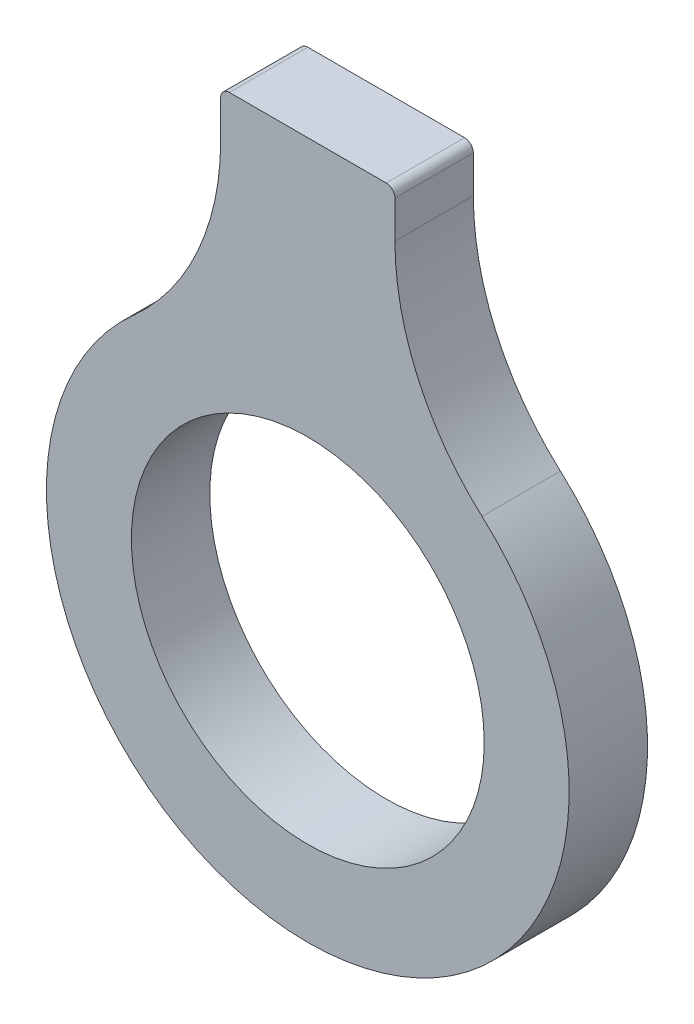
ISO-10303-21;
HEADER;
FILE_DESCRIPTION(('STEP AP214'),'2;1');
FILE_NAME('part.step','',(''),(''),'','','');
FILE_SCHEMA(('AUTOMOTIVE_DESIGN { 1 0 10303 214 1 1 1 1 }'));
ENDSEC;
DATA;
#1=APPLICATION_CONTEXT('core data for automotive mechanical design processes');
#2=APPLICATION_PROTOCOL_DEFINITION('international standard','automotive_design',2000,#1);
#3=PRODUCT_CONTEXT('',#1,'mechanical');
#4=PRODUCT('Part','Part','',(#3));
#5=PRODUCT_RELATED_PRODUCT_CATEGORY('part','',(#4));
#6=PRODUCT_DEFINITION_FORMATION('','',#4);
#7=PRODUCT_DEFINITION_CONTEXT('part definition',#1,'design');
#8=PRODUCT_DEFINITION('design','',#6,#7);
#9=PRODUCT_DEFINITION_SHAPE('','',#8);
#10=(LENGTH_UNIT() NAMED_UNIT(*) SI_UNIT(.MILLI.,.METRE.));
#11=(NAMED_UNIT(*) PLANE_ANGLE_UNIT() SI_UNIT($,.RADIAN.));
#12=(NAMED_UNIT(*) SI_UNIT($,.STERADIAN.) SOLID_ANGLE_UNIT());
#13=UNCERTAINTY_MEASURE_WITH_UNIT(LENGTH_MEASURE(1.E-05),#10,'distance_accuracy_value','');
#14=(GEOMETRIC_REPRESENTATION_CONTEXT(3) GLOBAL_UNCERTAINTY_ASSIGNED_CONTEXT((#13)) GLOBAL_UNIT_ASSIGNED_CONTEXT((#10,
#11,#12)) REPRESENTATION_CONTEXT('',''));
#15=CARTESIAN_POINT('',(0.,0.,0.));
#16=DIRECTION('',(0.,0.,1.));
#17=DIRECTION('',(1.,0.,0.));
#18=AXIS2_PLACEMENT_3D('',#15,#16,#17);
#19=CARTESIAN_POINT('',(-8.00000000000001,8.94427190999915,-1.8));
#20=DIRECTION('',(0.,0.,1.));
#21=DIRECTION('',(1.,0.,0.));
#22=AXIS2_PLACEMENT_3D('',#19,#20,#21);
#23=CYLINDRICAL_SURFACE('',#22,6.);
#24=CARTESIAN_POINT('',(-8.00000000000001,8.94427190999915,0.));
#25=DIRECTION('',(0.,0.,-1.));
#26=DIRECTION('',(1.,0.,0.));
#27=AXIS2_PLACEMENT_3D('',#24,#25,#26);
#28=CIRCLE('',#27,6.);
#29=CARTESIAN_POINT('',(-2.00000000000001,8.94427190999924,0.));
#30=VERTEX_POINT('',#29);
#31=CARTESIAN_POINT('',(-4.00000000000001,4.47213595499957,0.));
#32=VERTEX_POINT('',#31);
#33=EDGE_CURVE('E144',#30,#32,#28,.T.);
#34=ORIENTED_EDGE('',*,*,#33,.F.);
#35=DIRECTION('',(0.,0.,1.));
#36=VECTOR('',#35,1.);
#37=CARTESIAN_POINT('',(-2.00000000000001,8.94427190999924,-1.8));
#38=LINE('',#37,#36);
#39=CARTESIAN_POINT('',(-2.00000000000001,8.94427190999924,-1.8));
#40=VERTEX_POINT('',#39);
#41=EDGE_CURVE('E12',#40,#30,#38,.T.);
#42=ORIENTED_EDGE('',*,*,#41,.F.);
#43=CARTESIAN_POINT('',(-8.00000000000001,8.94427190999915,-1.8));
#44=DIRECTION('',(0.,0.,-1.));
#45=DIRECTION('',(1.,0.,0.));
#46=AXIS2_PLACEMENT_3D('',#43,#44,#45);
#47=CIRCLE('',#46,6.);
#48=CARTESIAN_POINT('',(-4.00000000000001,4.47213595499957,-1.8));
#49=VERTEX_POINT('',#48);
#50=EDGE_CURVE('E173',#40,#49,#47,.T.);
#51=ORIENTED_EDGE('',*,*,#50,.T.);
#52=DIRECTION('',(0.,0.,1.));
#53=VECTOR('',#52,1.);
#54=CARTESIAN_POINT('',(-4.00000000000001,4.47213595499957,-1.8));
#55=LINE('',#54,#53);
#56=EDGE_CURVE('E50',#49,#32,#55,.T.);
#57=ORIENTED_EDGE('',*,*,#56,.T.);
#58=EDGE_LOOP('',(#34,#42,#51,#57));
#59=FACE_BOUND('',#58,.T.);
#60=ADVANCED_FACE('F47',(#59),#23,.F.);
#61=CARTESIAN_POINT('',(-2.00000000000001,8.94427190999924,-1.8));
#62=DIRECTION('',(-1.,0.,0.));
#63=DIRECTION('',(0.,0.,1.));
#64=AXIS2_PLACEMENT_3D('',#61,#62,#63);
#65=PLANE('',#64);
#66=DIRECTION('',(0.,-1.,0.));
#67=VECTOR('',#66,1.);
#68=CARTESIAN_POINT('',(-2.00000000000001,8.94427190999924,0.));
#69=LINE('',#68,#67);
#70=CARTESIAN_POINT('',(-2.00000000000001,9.8,0.));
#71=VERTEX_POINT('',#70);
#72=EDGE_CURVE('E170',#71,#30,#69,.T.);
#73=ORIENTED_EDGE('',*,*,#72,.F.);
#74=DIRECTION('',(0.,0.,1.));
#75=VECTOR('',#74,1.);
#76=CARTESIAN_POINT('',(-2.00000000000001,9.8,-1.8));
#77=LINE('',#76,#75);
#78=CARTESIAN_POINT('',(-2.00000000000001,9.8,-1.8));
#79=VERTEX_POINT('',#78);
#80=EDGE_CURVE('E56',#79,#71,#77,.T.);
#81=ORIENTED_EDGE('',*,*,#80,.F.);
#82=DIRECTION('',(0.,-1.,0.));
#83=VECTOR('',#82,1.);
#84=CARTESIAN_POINT('',(-2.00000000000001,8.94427190999924,-1.8));
#85=LINE('',#84,#83);
#86=EDGE_CURVE('E134',#79,#40,#85,.T.);
#87=ORIENTED_EDGE('',*,*,#86,.T.);
#88=ORIENTED_EDGE('',*,*,#41,.T.);
#89=EDGE_LOOP('',(#73,#81,#87,#88));
#90=FACE_BOUND('',#89,.T.);
#91=ADVANCED_FACE('F185',(#90),#65,.T.);
#92=CARTESIAN_POINT('',(-1.80000000000001,9.8,-1.8));
#93=DIRECTION('',(0.,0.,1.));
#94=DIRECTION('',(1.,0.,0.));
#95=AXIS2_PLACEMENT_3D('',#92,#93,#94);
#96=CYLINDRICAL_SURFACE('',#95,0.199999999999999);
#97=CARTESIAN_POINT('',(-1.80000000000001,9.8,0.));
#98=DIRECTION('',(0.,0.,1.));
#99=DIRECTION('',(1.,0.,0.));
#100=AXIS2_PLACEMENT_3D('',#97,#98,#99);
#101=CIRCLE('',#100,0.199999999999999);
#102=CARTESIAN_POINT('',(-1.80000000000001,10.,0.));
#103=VERTEX_POINT('',#102);
#104=EDGE_CURVE('E121',#103,#71,#101,.T.);
#105=ORIENTED_EDGE('',*,*,#104,.F.);
#106=DIRECTION('',(0.,0.,1.));
#107=VECTOR('',#106,1.);
#108=CARTESIAN_POINT('',(-1.80000000000001,10.,-1.8));
#109=LINE('',#108,#107);
#110=CARTESIAN_POINT('',(-1.80000000000001,10.,-1.8));
#111=VERTEX_POINT('',#110);
#112=EDGE_CURVE('E116',#111,#103,#109,.T.);
#113=ORIENTED_EDGE('',*,*,#112,.F.);
#114=CARTESIAN_POINT('',(-1.80000000000001,9.8,-1.8));
#115=DIRECTION('',(0.,0.,1.));
#116=DIRECTION('',(1.,0.,0.));
#117=AXIS2_PLACEMENT_3D('',#114,#115,#116);
#118=CIRCLE('',#117,0.199999999999999);
#119=EDGE_CURVE('E119',#111,#79,#118,.T.);
#120=ORIENTED_EDGE('',*,*,#119,.T.);
#121=ORIENTED_EDGE('',*,*,#80,.T.);
#122=EDGE_LOOP('',(#105,#113,#120,#121));
#123=FACE_BOUND('',#122,.T.);
#124=ADVANCED_FACE('F118',(#123),#96,.T.);
#125=CARTESIAN_POINT('',(-1.80000000000001,10.,-1.8));
#126=DIRECTION('',(0.,1.,0.));
#127=DIRECTION('',(-1.,0.,0.));
#128=AXIS2_PLACEMENT_3D('',#125,#126,#127);
#129=PLANE('',#128);
#130=DIRECTION('',(-1.,0.,0.));
#131=VECTOR('',#130,1.);
#132=CARTESIAN_POINT('',(-1.80000000000001,10.,0.));
#133=LINE('',#132,#131);
#134=CARTESIAN_POINT('',(1.79999999999999,10.,0.));
#135=VERTEX_POINT('',#134);
#136=EDGE_CURVE('E165',#135,#103,#133,.T.);
#137=ORIENTED_EDGE('',*,*,#136,.F.);
#138=DIRECTION('',(0.,0.,1.));
#139=VECTOR('',#138,1.);
#140=CARTESIAN_POINT('',(1.79999999999999,10.,-1.8));
#141=LINE('',#140,#139);
#142=CARTESIAN_POINT('',(1.79999999999999,10.,-1.8));
#143=VERTEX_POINT('',#142);
#144=EDGE_CURVE('E126',#143,#135,#141,.T.);
#145=ORIENTED_EDGE('',*,*,#144,.F.);
#146=DIRECTION('',(-1.,0.,0.));
#147=VECTOR('',#146,1.);
#148=CARTESIAN_POINT('',(-1.80000000000001,10.,-1.8));
#149=LINE('',#148,#147);
#150=EDGE_CURVE('E132',#143,#111,#149,.T.);
#151=ORIENTED_EDGE('',*,*,#150,.T.);
#152=ORIENTED_EDGE('',*,*,#112,.T.);
#153=EDGE_LOOP('',(#137,#145,#151,#152));
#154=FACE_BOUND('',#153,.T.);
#155=ADVANCED_FACE('F136',(#154),#129,.T.);
#156=CARTESIAN_POINT('',(1.79999999999999,9.8,-1.8));
#157=DIRECTION('',(0.,0.,1.));
#158=DIRECTION('',(1.,0.,0.));
#159=AXIS2_PLACEMENT_3D('',#156,#157,#158);
#160=CYLINDRICAL_SURFACE('',#159,0.199999999999999);
#161=CARTESIAN_POINT('',(1.79999999999999,9.8,0.));
#162=DIRECTION('',(0.,0.,1.));
#163=DIRECTION('',(1.,0.,0.));
#164=AXIS2_PLACEMENT_3D('',#161,#162,#163);
#165=CIRCLE('',#164,0.199999999999999);
#166=CARTESIAN_POINT('',(1.99999999999999,9.80000000000001,0.));
#167=VERTEX_POINT('',#166);
#168=EDGE_CURVE('E161',#167,#135,#165,.T.);
#169=ORIENTED_EDGE('',*,*,#168,.F.);
#170=DIRECTION('',(0.,0.,1.));
#171=VECTOR('',#170,1.);
#172=CARTESIAN_POINT('',(1.99999999999999,9.80000000000001,-1.8));
#173=LINE('',#172,#171);
#174=CARTESIAN_POINT('',(1.99999999999999,9.80000000000001,-1.8));
#175=VERTEX_POINT('',#174);
#176=EDGE_CURVE('E177',#175,#167,#173,.T.);
#177=ORIENTED_EDGE('',*,*,#176,.F.);
#178=CARTESIAN_POINT('',(1.79999999999999,9.8,-1.8));
#179=DIRECTION('',(0.,0.,1.));
#180=DIRECTION('',(1.,0.,0.));
#181=AXIS2_PLACEMENT_3D('',#178,#179,#180);
#182=CIRCLE('',#181,0.199999999999999);
#183=EDGE_CURVE('E137',#175,#143,#182,.T.);
#184=ORIENTED_EDGE('',*,*,#183,.T.);
#185=ORIENTED_EDGE('',*,*,#144,.T.);
#186=EDGE_LOOP('',(#169,#177,#184,#185));
#187=FACE_BOUND('',#186,.T.);
#188=ADVANCED_FACE('F198',(#187),#160,.T.);
#189=CARTESIAN_POINT('',(1.99999999999999,8.94427190999917,-1.8));
#190=DIRECTION('',(1.,0.,0.));
#191=DIRECTION('',(0.,0.,-1.));
#192=AXIS2_PLACEMENT_3D('',#189,#190,#191);
#193=PLANE('',#192);
#194=DIRECTION('',(0.,1.,0.));
#195=VECTOR('',#194,1.);
#196=CARTESIAN_POINT('',(1.99999999999999,8.94427190999917,0.));
#197=LINE('',#196,#195);
#198=CARTESIAN_POINT('',(1.99999999999999,8.94427190999917,0.));
#199=VERTEX_POINT('',#198);
#200=EDGE_CURVE('E157',#199,#167,#197,.T.);
#201=ORIENTED_EDGE('',*,*,#200,.F.);
#202=DIRECTION('',(0.,0.,1.));
#203=VECTOR('',#202,1.);
#204=CARTESIAN_POINT('',(1.99999999999999,8.94427190999917,-1.8));
#205=LINE('',#204,#203);
#206=CARTESIAN_POINT('',(1.99999999999999,8.94427190999917,-1.8));
#207=VERTEX_POINT('',#206);
#208=EDGE_CURVE('E179',#207,#199,#205,.T.);
#209=ORIENTED_EDGE('',*,*,#208,.F.);
#210=DIRECTION('',(0.,1.,0.));
#211=VECTOR('',#210,1.);
#212=CARTESIAN_POINT('',(1.99999999999999,8.94427190999917,-1.8));
#213=LINE('',#212,#211);
#214=EDGE_CURVE('E139',#207,#175,#213,.T.);
#215=ORIENTED_EDGE('',*,*,#214,.T.);
#216=ORIENTED_EDGE('',*,*,#176,.T.);
#217=EDGE_LOOP('',(#201,#209,#215,#216));
#218=FACE_BOUND('',#217,.T.);
#219=ADVANCED_FACE('F201',(#218),#193,.T.);
#220=CARTESIAN_POINT('',(7.99999999999999,8.94427190999917,-1.8));
#221=DIRECTION('',(0.,0.,1.));
#222=DIRECTION('',(1.,0.,0.));
#223=AXIS2_PLACEMENT_3D('',#220,#221,#222);
#224=CYLINDRICAL_SURFACE('',#223,6.);
#225=CARTESIAN_POINT('',(7.99999999999999,8.94427190999917,0.));
#226=DIRECTION('',(0.,0.,-1.));
#227=DIRECTION('',(1.,0.,0.));
#228=AXIS2_PLACEMENT_3D('',#225,#226,#227);
#229=CIRCLE('',#228,6.);
#230=CARTESIAN_POINT('',(3.99999999999999,4.47213595499958,0.));
#231=VERTEX_POINT('',#230);
#232=EDGE_CURVE('E153',#231,#199,#229,.T.);
#233=ORIENTED_EDGE('',*,*,#232,.F.);
#234=DIRECTION('',(0.,0.,1.));
#235=VECTOR('',#234,1.);
#236=CARTESIAN_POINT('',(3.99999999999999,4.47213595499958,-1.8));
#237=LINE('',#236,#235);
#238=CARTESIAN_POINT('',(3.99999999999999,4.47213595499958,-1.8));
#239=VERTEX_POINT('',#238);
#240=EDGE_CURVE('E180',#239,#231,#237,.T.);
#241=ORIENTED_EDGE('',*,*,#240,.F.);
#242=CARTESIAN_POINT('',(7.99999999999999,8.94427190999917,-1.8));
#243=DIRECTION('',(0.,0.,-1.));
#244=DIRECTION('',(1.,0.,0.));
#245=AXIS2_PLACEMENT_3D('',#242,#243,#244);
#246=CIRCLE('',#245,6.);
#247=EDGE_CURVE('E238',#239,#207,#246,.T.);
#248=ORIENTED_EDGE('',*,*,#247,.T.);
#249=ORIENTED_EDGE('',*,*,#208,.T.);
#250=EDGE_LOOP('',(#233,#241,#248,#249));
#251=FACE_BOUND('',#250,.T.);
#252=ADVANCED_FACE('F205',(#251),#224,.F.);
#253=CARTESIAN_POINT('',(0.,0.,-1.8));
#254=DIRECTION('',(0.,0.,1.));
#255=DIRECTION('',(1.,0.,0.));
#256=AXIS2_PLACEMENT_3D('',#253,#254,#255);
#257=CYLINDRICAL_SURFACE('',#256,6.);
#258=CARTESIAN_POINT('',(0.,0.,0.));
#259=DIRECTION('',(0.,0.,1.));
#260=DIRECTION('',(1.,0.,0.));
#261=AXIS2_PLACEMENT_3D('',#258,#259,#260);
#262=CIRCLE('',#261,6.);
#263=EDGE_CURVE('E148',#32,#231,#262,.T.);
#264=ORIENTED_EDGE('',*,*,#263,.F.);
#265=ORIENTED_EDGE('',*,*,#56,.F.);
#266=CARTESIAN_POINT('',(0.,0.,-1.8));
#267=DIRECTION('',(0.,0.,1.));
#268=DIRECTION('',(1.,0.,0.));
#269=AXIS2_PLACEMENT_3D('',#266,#267,#268);
#270=CIRCLE('',#269,6.);
#271=EDGE_CURVE('E236',#49,#239,#270,.T.);
#272=ORIENTED_EDGE('',*,*,#271,.T.);
#273=ORIENTED_EDGE('',*,*,#240,.T.);
#274=EDGE_LOOP('',(#264,#265,#272,#273));
#275=FACE_BOUND('',#274,.T.);
#276=ADVANCED_FACE('F182',(#275),#257,.T.);
#277=CARTESIAN_POINT('',(-8.00000000000001,8.94427190999915,-1.8));
#278=DIRECTION('',(0.,0.,1.));
#279=DIRECTION('',(1.,0.,0.));
#280=AXIS2_PLACEMENT_3D('',#277,#278,#279);
#281=PLANE('',#280);
#282=CARTESIAN_POINT('',(0.,0.,-1.8));
#283=DIRECTION('',(0.,0.,1.));
#284=DIRECTION('',(1.,0.,0.));
#285=AXIS2_PLACEMENT_3D('',#282,#283,#284);
#286=CIRCLE('',#285,4.05);
#287=CARTESIAN_POINT('',(4.05,0.,-1.8));
#288=VERTEX_POINT('',#287);
#289=EDGE_CURVE('E149',#288,#288,#286,.T.);
#290=ORIENTED_EDGE('',*,*,#289,.T.);
#291=EDGE_LOOP('',(#290));
#292=FACE_BOUND('',#291,.T.);
#293=ORIENTED_EDGE('',*,*,#50,.F.);
#294=ORIENTED_EDGE('',*,*,#86,.F.);
#295=ORIENTED_EDGE('',*,*,#119,.F.);
#296=ORIENTED_EDGE('',*,*,#150,.F.);
#297=ORIENTED_EDGE('',*,*,#183,.F.);
#298=ORIENTED_EDGE('',*,*,#214,.F.);
#299=ORIENTED_EDGE('',*,*,#247,.F.);
#300=ORIENTED_EDGE('',*,*,#271,.F.);
#301=EDGE_LOOP('',(#293,#294,#295,#296,#297,#298,#299,#300));
#302=FACE_BOUND('',#301,.T.);
#303=ADVANCED_FACE('F130',(#292,#302),#281,.F.);
#304=CARTESIAN_POINT('',(-8.00000000000001,8.94427190999915,0.));
#305=DIRECTION('',(0.,0.,1.));
#306=DIRECTION('',(1.,0.,0.));
#307=AXIS2_PLACEMENT_3D('',#304,#305,#306);
#308=PLANE('',#307);
#309=CARTESIAN_POINT('',(0.,0.,0.));
#310=DIRECTION('',(0.,0.,1.));
#311=DIRECTION('',(1.,0.,0.));
#312=AXIS2_PLACEMENT_3D('',#309,#310,#311);
#313=CIRCLE('',#312,4.05);
#314=CARTESIAN_POINT('',(4.05,0.,0.));
#315=VERTEX_POINT('',#314);
#316=EDGE_CURVE('E230',#315,#315,#313,.T.);
#317=ORIENTED_EDGE('',*,*,#316,.F.);
#318=EDGE_LOOP('',(#317));
#319=FACE_BOUND('',#318,.T.);
#320=ORIENTED_EDGE('',*,*,#33,.T.);
#321=ORIENTED_EDGE('',*,*,#263,.T.);
#322=ORIENTED_EDGE('',*,*,#232,.T.);
#323=ORIENTED_EDGE('',*,*,#200,.T.);
#324=ORIENTED_EDGE('',*,*,#168,.T.);
#325=ORIENTED_EDGE('',*,*,#136,.T.);
#326=ORIENTED_EDGE('',*,*,#104,.T.);
#327=ORIENTED_EDGE('',*,*,#72,.T.);
#328=EDGE_LOOP('',(#320,#321,#322,#323,#324,#325,#326,#327));
#329=FACE_BOUND('',#328,.T.);
#330=ADVANCED_FACE('F184',(#319,#329),#308,.T.);
#331=CARTESIAN_POINT('',(0.,0.,-1.8));
#332=DIRECTION('',(0.,0.,1.));
#333=DIRECTION('',(1.,0.,0.));
#334=AXIS2_PLACEMENT_3D('',#331,#332,#333);
#335=CYLINDRICAL_SURFACE('',#334,4.05);
#336=ORIENTED_EDGE('',*,*,#289,.F.);
#337=EDGE_LOOP('',(#336));
#338=FACE_BOUND('',#337,.T.);
#339=ORIENTED_EDGE('',*,*,#316,.T.);
#340=EDGE_LOOP('',(#339));
#341=FACE_BOUND('',#340,.T.);
#342=ADVANCED_FACE('F217',(#338,#341),#335,.F.);
#343=CLOSED_SHELL('',(#60,#91,#124,#155,#188,#219,#252,#276,#303,#330,#342));
#344=MANIFOLD_SOLID_BREP('B2',#343);
#345=ADVANCED_BREP_SHAPE_REPRESENTATION('',(#18,#344),#14);
#346=SHAPE_DEFINITION_REPRESENTATION(#9,#345);
ENDSEC;
END-ISO-10303-21;
